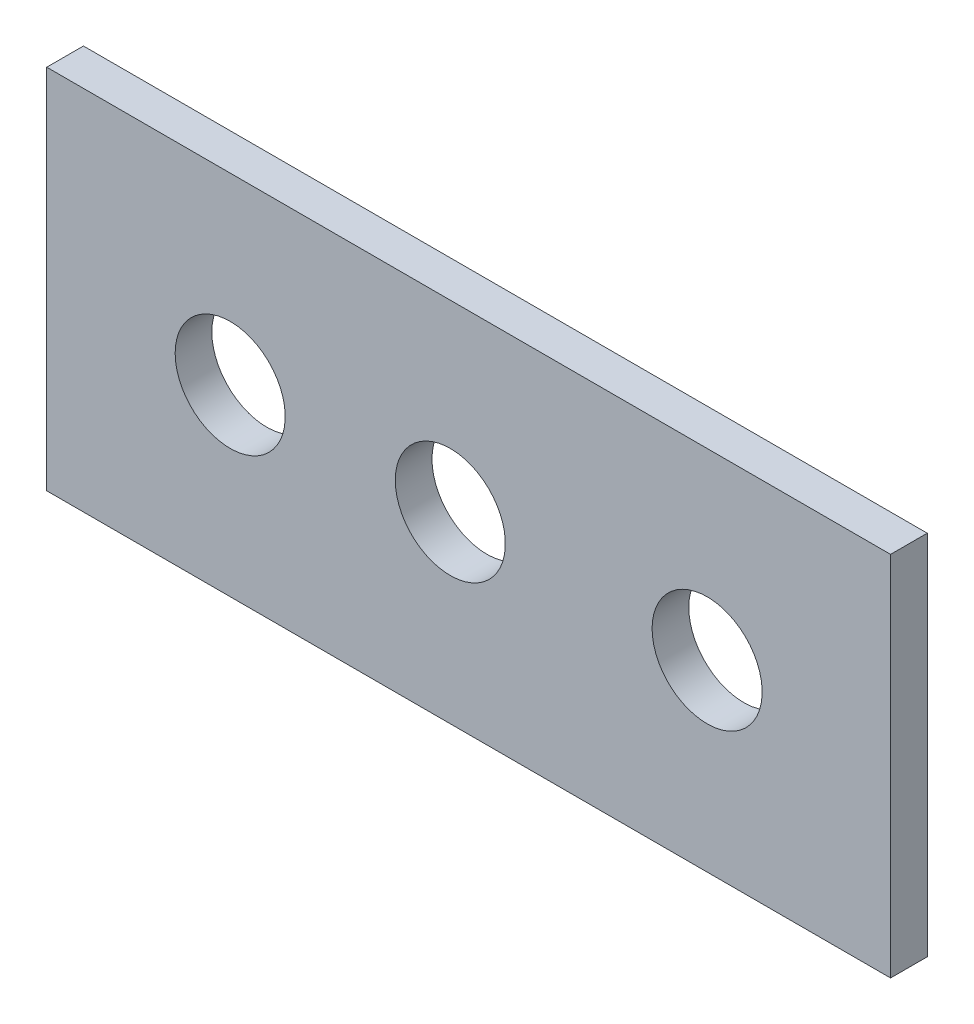
ISO-10303-21;
HEADER;
FILE_DESCRIPTION(('STEP AP214'),'2;1');
FILE_NAME('part.step','',(''),(''),'','','');
FILE_SCHEMA(('AUTOMOTIVE_DESIGN { 1 0 10303 214 1 1 1 1 }'));
ENDSEC;
DATA;
#1=APPLICATION_CONTEXT('core data for automotive mechanical design processes');
#2=APPLICATION_PROTOCOL_DEFINITION('international standard','automotive_design',2000,#1);
#3=PRODUCT_CONTEXT('',#1,'mechanical');
#4=PRODUCT('Part','Part','',(#3));
#5=PRODUCT_RELATED_PRODUCT_CATEGORY('part','',(#4));
#6=PRODUCT_DEFINITION_FORMATION('','',#4);
#7=PRODUCT_DEFINITION_CONTEXT('part definition',#1,'design');
#8=PRODUCT_DEFINITION('design','',#6,#7);
#9=PRODUCT_DEFINITION_SHAPE('','',#8);
#10=(LENGTH_UNIT() NAMED_UNIT(*) SI_UNIT(.MILLI.,.METRE.));
#11=(NAMED_UNIT(*) PLANE_ANGLE_UNIT() SI_UNIT($,.RADIAN.));
#12=(NAMED_UNIT(*) SI_UNIT($,.STERADIAN.) SOLID_ANGLE_UNIT());
#13=UNCERTAINTY_MEASURE_WITH_UNIT(LENGTH_MEASURE(1.E-05),#10,'distance_accuracy_value','');
#14=(GEOMETRIC_REPRESENTATION_CONTEXT(3) GLOBAL_UNCERTAINTY_ASSIGNED_CONTEXT((#13)) GLOBAL_UNIT_ASSIGNED_CONTEXT((#10,
#11,#12)) REPRESENTATION_CONTEXT('',''));
#15=CARTESIAN_POINT('',(0.,0.,0.));
#16=DIRECTION('',(0.,0.,1.));
#17=DIRECTION('',(1.,0.,0.));
#18=AXIS2_PLACEMENT_3D('',#15,#16,#17);
#19=CARTESIAN_POINT('',(0.,100.,0.));
#20=DIRECTION('',(-1.,0.,0.));
#21=DIRECTION('',(0.,0.,1.));
#22=AXIS2_PLACEMENT_3D('',#19,#20,#21);
#23=PLANE('',#22);
#24=DIRECTION('',(0.,0.,-1.));
#25=VECTOR('',#24,1.);
#26=CARTESIAN_POINT('',(0.,0.,0.));
#27=LINE('',#26,#25);
#28=CARTESIAN_POINT('',(0.,0.,0.));
#29=VERTEX_POINT('',#28);
#30=CARTESIAN_POINT('',(0.,0.,-10.));
#31=VERTEX_POINT('',#30);
#32=EDGE_CURVE('E104',#29,#31,#27,.T.);
#33=ORIENTED_EDGE('',*,*,#32,.T.);
#34=DIRECTION('',(0.,-1.,0.));
#35=VECTOR('',#34,1.);
#36=CARTESIAN_POINT('',(0.,100.,-10.));
#37=LINE('',#36,#35);
#38=CARTESIAN_POINT('',(0.,100.,-10.));
#39=VERTEX_POINT('',#38);
#40=EDGE_CURVE('E11',#39,#31,#37,.T.);
#41=ORIENTED_EDGE('',*,*,#40,.F.);
#42=DIRECTION('',(0.,0.,-1.));
#43=VECTOR('',#42,1.);
#44=CARTESIAN_POINT('',(0.,100.,0.));
#45=LINE('',#44,#43);
#46=CARTESIAN_POINT('',(0.,100.,0.));
#47=VERTEX_POINT('',#46);
#48=EDGE_CURVE('E92',#47,#39,#45,.T.);
#49=ORIENTED_EDGE('',*,*,#48,.F.);
#50=DIRECTION('',(0.,-1.,0.));
#51=VECTOR('',#50,1.);
#52=CARTESIAN_POINT('',(0.,100.,0.));
#53=LINE('',#52,#51);
#54=EDGE_CURVE('E100',#47,#29,#53,.T.);
#55=ORIENTED_EDGE('',*,*,#54,.T.);
#56=EDGE_LOOP('',(#33,#41,#49,#55));
#57=FACE_BOUND('',#56,.T.);
#58=ADVANCED_FACE('F41',(#57),#23,.F.);
#59=CARTESIAN_POINT('',(0.,100.,-10.));
#60=DIRECTION('',(0.,0.,1.));
#61=DIRECTION('',(1.,0.,0.));
#62=AXIS2_PLACEMENT_3D('',#59,#60,#61);
#63=PLANE('',#62);
#64=CARTESIAN_POINT('',(-50.,50.,-9.99999999999999));
#65=DIRECTION('',(0.,0.,-1.));
#66=DIRECTION('',(-1.,0.,0.));
#67=AXIS2_PLACEMENT_3D('',#64,#65,#66);
#68=CIRCLE('',#67,15.);
#69=CARTESIAN_POINT('',(-65.,50.,-9.99999999999999));
#70=VERTEX_POINT('',#69);
#71=EDGE_CURVE('E130',#70,#70,#68,.T.);
#72=ORIENTED_EDGE('',*,*,#71,.F.);
#73=EDGE_LOOP('',(#72));
#74=FACE_BOUND('',#73,.T.);
#75=CARTESIAN_POINT('',(-180.,50.,-9.99999999999997));
#76=DIRECTION('',(0.,0.,-1.));
#77=DIRECTION('',(-1.,0.,0.));
#78=AXIS2_PLACEMENT_3D('',#75,#76,#77);
#79=CIRCLE('',#78,15.);
#80=CARTESIAN_POINT('',(-195.,50.,-9.99999999999997));
#81=VERTEX_POINT('',#80);
#82=EDGE_CURVE('E127',#81,#81,#79,.T.);
#83=ORIENTED_EDGE('',*,*,#82,.F.);
#84=EDGE_LOOP('',(#83));
#85=FACE_BOUND('',#84,.T.);
#86=CARTESIAN_POINT('',(-120.,50.,-9.99999999999998));
#87=DIRECTION('',(0.,0.,-1.));
#88=DIRECTION('',(-1.,0.,0.));
#89=AXIS2_PLACEMENT_3D('',#86,#87,#88);
#90=CIRCLE('',#89,15.);
#91=CARTESIAN_POINT('',(-135.,50.,-9.99999999999998));
#92=VERTEX_POINT('',#91);
#93=EDGE_CURVE('E121',#92,#92,#90,.T.);
#94=ORIENTED_EDGE('',*,*,#93,.F.);
#95=EDGE_LOOP('',(#94));
#96=FACE_BOUND('',#95,.T.);
#97=DIRECTION('',(-1.,0.,0.));
#98=VECTOR('',#97,1.);
#99=CARTESIAN_POINT('',(0.,0.,-10.));
#100=LINE('',#99,#98);
#101=CARTESIAN_POINT('',(-230.,0.,-9.99999999999996));
#102=VERTEX_POINT('',#101);
#103=EDGE_CURVE('E96',#31,#102,#100,.T.);
#104=ORIENTED_EDGE('',*,*,#103,.T.);
#105=DIRECTION('',(0.,-1.,0.));
#106=VECTOR('',#105,1.);
#107=CARTESIAN_POINT('',(-230.,100.,-9.99999999999996));
#108=LINE('',#107,#106);
#109=CARTESIAN_POINT('',(-230.,100.,-9.99999999999996));
#110=VERTEX_POINT('',#109);
#111=EDGE_CURVE('E49',#110,#102,#108,.T.);
#112=ORIENTED_EDGE('',*,*,#111,.F.);
#113=DIRECTION('',(-1.,0.,0.));
#114=VECTOR('',#113,1.);
#115=CARTESIAN_POINT('',(0.,100.,-10.));
#116=LINE('',#115,#114);
#117=EDGE_CURVE('E87',#39,#110,#116,.T.);
#118=ORIENTED_EDGE('',*,*,#117,.F.);
#119=ORIENTED_EDGE('',*,*,#40,.T.);
#120=EDGE_LOOP('',(#104,#112,#118,#119));
#121=FACE_BOUND('',#120,.T.);
#122=ADVANCED_FACE('F95',(#74,#85,#96,#121),#63,.F.);
#123=CARTESIAN_POINT('',(-230.,100.,0.));
#124=DIRECTION('',(1.,0.,0.));
#125=DIRECTION('',(0.,0.,-1.));
#126=AXIS2_PLACEMENT_3D('',#123,#124,#125);
#127=PLANE('',#126);
#128=DIRECTION('',(0.,0.,1.));
#129=VECTOR('',#128,1.);
#130=CARTESIAN_POINT('',(-230.,0.,0.));
#131=LINE('',#130,#129);
#132=CARTESIAN_POINT('',(-230.,0.,0.));
#133=VERTEX_POINT('',#132);
#134=EDGE_CURVE('E74',#102,#133,#131,.T.);
#135=ORIENTED_EDGE('',*,*,#134,.T.);
#136=DIRECTION('',(0.,-1.,0.));
#137=VECTOR('',#136,1.);
#138=CARTESIAN_POINT('',(-230.,100.,0.));
#139=LINE('',#138,#137);
#140=CARTESIAN_POINT('',(-230.,100.,0.));
#141=VERTEX_POINT('',#140);
#142=EDGE_CURVE('E97',#141,#133,#139,.T.);
#143=ORIENTED_EDGE('',*,*,#142,.F.);
#144=DIRECTION('',(0.,0.,1.));
#145=VECTOR('',#144,1.);
#146=CARTESIAN_POINT('',(-230.,100.,0.));
#147=LINE('',#146,#145);
#148=EDGE_CURVE('E90',#110,#141,#147,.T.);
#149=ORIENTED_EDGE('',*,*,#148,.F.);
#150=ORIENTED_EDGE('',*,*,#111,.T.);
#151=EDGE_LOOP('',(#135,#143,#149,#150));
#152=FACE_BOUND('',#151,.T.);
#153=ADVANCED_FACE('F98',(#152),#127,.F.);
#154=CARTESIAN_POINT('',(0.,100.,0.));
#155=DIRECTION('',(0.,0.,-1.));
#156=DIRECTION('',(-1.,0.,0.));
#157=AXIS2_PLACEMENT_3D('',#154,#155,#156);
#158=PLANE('',#157);
#159=CARTESIAN_POINT('',(-50.,50.,0.));
#160=DIRECTION('',(0.,0.,-1.));
#161=DIRECTION('',(-1.,0.,0.));
#162=AXIS2_PLACEMENT_3D('',#159,#160,#161);
#163=CIRCLE('',#162,15.);
#164=CARTESIAN_POINT('',(-65.,50.,0.));
#165=VERTEX_POINT('',#164);
#166=EDGE_CURVE('E107',#165,#165,#163,.T.);
#167=ORIENTED_EDGE('',*,*,#166,.T.);
#168=EDGE_LOOP('',(#167));
#169=FACE_BOUND('',#168,.T.);
#170=CARTESIAN_POINT('',(-180.,50.,0.));
#171=DIRECTION('',(0.,0.,-1.));
#172=DIRECTION('',(-1.,0.,0.));
#173=AXIS2_PLACEMENT_3D('',#170,#171,#172);
#174=CIRCLE('',#173,15.);
#175=CARTESIAN_POINT('',(-195.,50.,0.));
#176=VERTEX_POINT('',#175);
#177=EDGE_CURVE('E124',#176,#176,#174,.T.);
#178=ORIENTED_EDGE('',*,*,#177,.T.);
#179=EDGE_LOOP('',(#178));
#180=FACE_BOUND('',#179,.T.);
#181=CARTESIAN_POINT('',(-120.,50.,0.));
#182=DIRECTION('',(0.,0.,-1.));
#183=DIRECTION('',(-1.,0.,0.));
#184=AXIS2_PLACEMENT_3D('',#181,#182,#183);
#185=CIRCLE('',#184,15.);
#186=CARTESIAN_POINT('',(-135.,50.,0.));
#187=VERTEX_POINT('',#186);
#188=EDGE_CURVE('E118',#187,#187,#185,.T.);
#189=ORIENTED_EDGE('',*,*,#188,.T.);
#190=EDGE_LOOP('',(#189));
#191=FACE_BOUND('',#190,.T.);
#192=DIRECTION('',(1.,0.,0.));
#193=VECTOR('',#192,1.);
#194=CARTESIAN_POINT('',(0.,0.,0.));
#195=LINE('',#194,#193);
#196=EDGE_CURVE('E80',#133,#29,#195,.T.);
#197=ORIENTED_EDGE('',*,*,#196,.T.);
#198=ORIENTED_EDGE('',*,*,#54,.F.);
#199=DIRECTION('',(1.,0.,0.));
#200=VECTOR('',#199,1.);
#201=CARTESIAN_POINT('',(0.,100.,0.));
#202=LINE('',#201,#200);
#203=EDGE_CURVE('E57',#141,#47,#202,.T.);
#204=ORIENTED_EDGE('',*,*,#203,.F.);
#205=ORIENTED_EDGE('',*,*,#142,.T.);
#206=EDGE_LOOP('',(#197,#198,#204,#205));
#207=FACE_BOUND('',#206,.T.);
#208=ADVANCED_FACE('F112',(#169,#180,#191,#207),#158,.F.);
#209=CARTESIAN_POINT('',(0.,100.,0.));
#210=DIRECTION('',(0.,1.,0.));
#211=DIRECTION('',(0.,0.,1.));
#212=AXIS2_PLACEMENT_3D('',#209,#210,#211);
#213=PLANE('',#212);
#214=ORIENTED_EDGE('',*,*,#48,.T.);
#215=ORIENTED_EDGE('',*,*,#117,.T.);
#216=ORIENTED_EDGE('',*,*,#148,.T.);
#217=ORIENTED_EDGE('',*,*,#203,.T.);
#218=EDGE_LOOP('',(#214,#215,#216,#217));
#219=FACE_BOUND('',#218,.T.);
#220=ADVANCED_FACE('F88',(#219),#213,.T.);
#221=CARTESIAN_POINT('',(0.,0.,0.));
#222=DIRECTION('',(0.,1.,0.));
#223=DIRECTION('',(0.,0.,1.));
#224=AXIS2_PLACEMENT_3D('',#221,#222,#223);
#225=PLANE('',#224);
#226=ORIENTED_EDGE('',*,*,#32,.F.);
#227=ORIENTED_EDGE('',*,*,#196,.F.);
#228=ORIENTED_EDGE('',*,*,#134,.F.);
#229=ORIENTED_EDGE('',*,*,#103,.F.);
#230=EDGE_LOOP('',(#226,#227,#228,#229));
#231=FACE_BOUND('',#230,.T.);
#232=ADVANCED_FACE('F115',(#231),#225,.F.);
#233=CARTESIAN_POINT('',(-120.,50.,0.));
#234=DIRECTION('',(0.,0.,-1.));
#235=DIRECTION('',(-1.,0.,0.));
#236=AXIS2_PLACEMENT_3D('',#233,#234,#235);
#237=CYLINDRICAL_SURFACE('',#236,15.);
#238=ORIENTED_EDGE('',*,*,#188,.F.);
#239=EDGE_LOOP('',(#238));
#240=FACE_BOUND('',#239,.T.);
#241=ORIENTED_EDGE('',*,*,#93,.T.);
#242=EDGE_LOOP('',(#241));
#243=FACE_BOUND('',#242,.T.);
#244=ADVANCED_FACE('F151',(#240,#243),#237,.F.);
#245=CARTESIAN_POINT('',(-180.,50.,0.));
#246=DIRECTION('',(0.,0.,-1.));
#247=DIRECTION('',(-1.,0.,0.));
#248=AXIS2_PLACEMENT_3D('',#245,#246,#247);
#249=CYLINDRICAL_SURFACE('',#248,15.);
#250=ORIENTED_EDGE('',*,*,#177,.F.);
#251=EDGE_LOOP('',(#250));
#252=FACE_BOUND('',#251,.T.);
#253=ORIENTED_EDGE('',*,*,#82,.T.);
#254=EDGE_LOOP('',(#253));
#255=FACE_BOUND('',#254,.T.);
#256=ADVANCED_FACE('F141',(#252,#255),#249,.F.);
#257=CARTESIAN_POINT('',(-50.,50.,0.));
#258=DIRECTION('',(0.,0.,-1.));
#259=DIRECTION('',(-1.,0.,0.));
#260=AXIS2_PLACEMENT_3D('',#257,#258,#259);
#261=CYLINDRICAL_SURFACE('',#260,15.);
#262=ORIENTED_EDGE('',*,*,#166,.F.);
#263=EDGE_LOOP('',(#262));
#264=FACE_BOUND('',#263,.T.);
#265=ORIENTED_EDGE('',*,*,#71,.T.);
#266=EDGE_LOOP('',(#265));
#267=FACE_BOUND('',#266,.T.);
#268=ADVANCED_FACE('F138',(#264,#267),#261,.F.);
#269=CLOSED_SHELL('',(#58,#122,#153,#208,#220,#232,#244,#256,#268));
#270=MANIFOLD_SOLID_BREP('B2',#269);
#271=ADVANCED_BREP_SHAPE_REPRESENTATION('',(#18,#270),#14);
#272=SHAPE_DEFINITION_REPRESENTATION(#9,#271);
ENDSEC;
END-ISO-10303-21;
